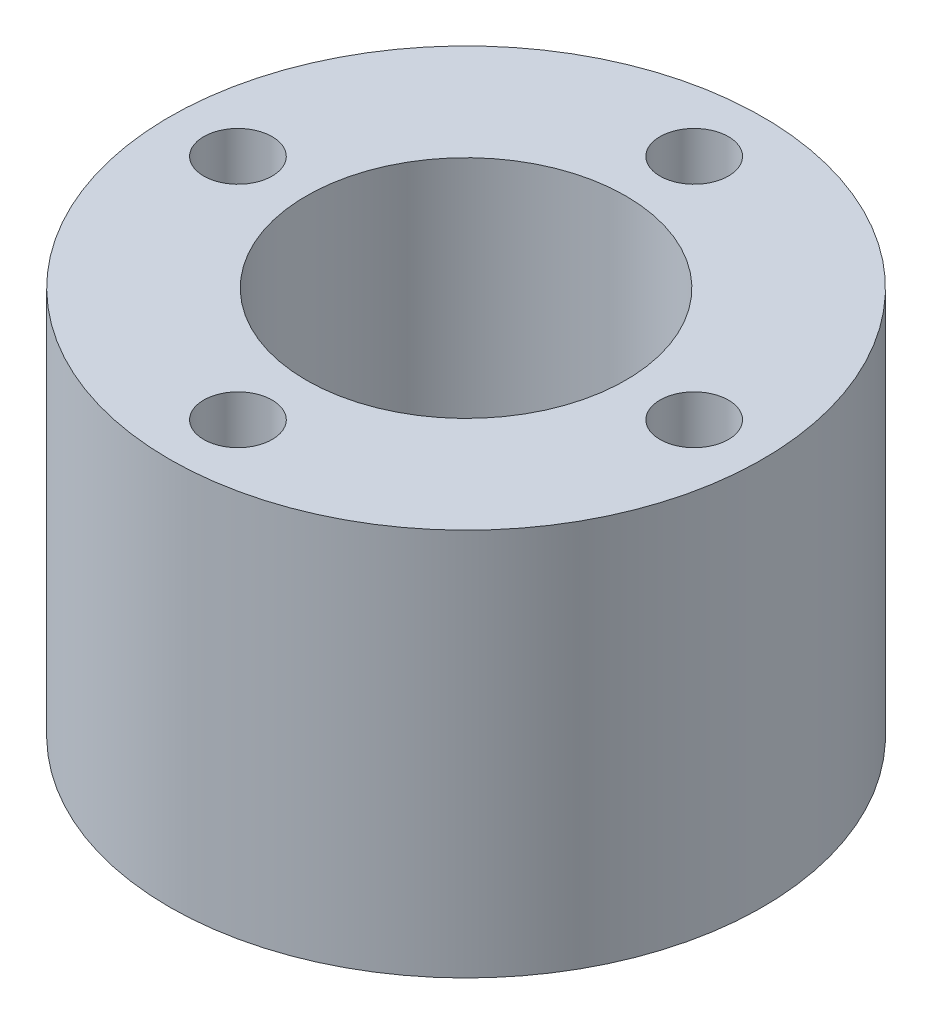
ISO-10303-21;
HEADER;
FILE_DESCRIPTION(('STEP AP214'),'2;1');
FILE_NAME('part.step','',(''),(''),'','','');
FILE_SCHEMA(('AUTOMOTIVE_DESIGN { 1 0 10303 214 1 1 1 1 }'));
ENDSEC;
DATA;
#1=APPLICATION_CONTEXT('core data for automotive mechanical design processes');
#2=APPLICATION_PROTOCOL_DEFINITION('international standard','automotive_design',2000,#1);
#3=PRODUCT_CONTEXT('',#1,'mechanical');
#4=PRODUCT('Part','Part','',(#3));
#5=PRODUCT_RELATED_PRODUCT_CATEGORY('part','',(#4));
#6=PRODUCT_DEFINITION_FORMATION('','',#4);
#7=PRODUCT_DEFINITION_CONTEXT('part definition',#1,'design');
#8=PRODUCT_DEFINITION('design','',#6,#7);
#9=PRODUCT_DEFINITION_SHAPE('','',#8);
#10=(LENGTH_UNIT() NAMED_UNIT(*) SI_UNIT(.MILLI.,.METRE.));
#11=(NAMED_UNIT(*) PLANE_ANGLE_UNIT() SI_UNIT($,.RADIAN.));
#12=(NAMED_UNIT(*) SI_UNIT($,.STERADIAN.) SOLID_ANGLE_UNIT());
#13=UNCERTAINTY_MEASURE_WITH_UNIT(LENGTH_MEASURE(1.E-05),#10,'distance_accuracy_value','');
#14=(GEOMETRIC_REPRESENTATION_CONTEXT(3) GLOBAL_UNCERTAINTY_ASSIGNED_CONTEXT((#13)) GLOBAL_UNIT_ASSIGNED_CONTEXT((#10,
#11,#12)) REPRESENTATION_CONTEXT('',''));
#15=CARTESIAN_POINT('',(0.,0.,0.));
#16=DIRECTION('',(0.,0.,1.));
#17=DIRECTION('',(1.,0.,0.));
#18=AXIS2_PLACEMENT_3D('',#15,#16,#17);
#19=CARTESIAN_POINT('',(0.,17.,0.));
#20=DIRECTION('',(0.,1.,0.));
#21=DIRECTION('',(0.,0.,1.));
#22=AXIS2_PLACEMENT_3D('',#19,#20,#21);
#23=PLANE('',#22);
#24=CARTESIAN_POINT('',(10.,17.,0.));
#25=DIRECTION('',(0.,1.,0.));
#26=DIRECTION('',(0.,0.,1.));
#27=AXIS2_PLACEMENT_3D('',#24,#25,#26);
#28=CIRCLE('',#27,1.5);
#29=CARTESIAN_POINT('',(10.,17.,1.5));
#30=VERTEX_POINT('',#29);
#31=EDGE_CURVE('E61',#30,#30,#28,.T.);
#32=ORIENTED_EDGE('',*,*,#31,.F.);
#33=EDGE_LOOP('',(#32));
#34=FACE_BOUND('',#33,.T.);
#35=CARTESIAN_POINT('',(0.,17.,-10.));
#36=DIRECTION('',(0.,1.,0.));
#37=DIRECTION('',(0.,0.,1.));
#38=AXIS2_PLACEMENT_3D('',#35,#36,#37);
#39=CIRCLE('',#38,1.5);
#40=CARTESIAN_POINT('',(0.,17.,-8.5));
#41=VERTEX_POINT('',#40);
#42=EDGE_CURVE('E52',#41,#41,#39,.T.);
#43=ORIENTED_EDGE('',*,*,#42,.F.);
#44=EDGE_LOOP('',(#43));
#45=FACE_BOUND('',#44,.T.);
#46=CARTESIAN_POINT('',(0.,17.,0.));
#47=DIRECTION('',(0.,1.,0.));
#48=DIRECTION('',(0.,0.,1.));
#49=AXIS2_PLACEMENT_3D('',#46,#47,#48);
#50=CIRCLE('',#49,13.);
#51=CARTESIAN_POINT('',(0.,17.,13.));
#52=VERTEX_POINT('',#51);
#53=EDGE_CURVE('E10',#52,#52,#50,.T.);
#54=ORIENTED_EDGE('',*,*,#53,.T.);
#55=EDGE_LOOP('',(#54));
#56=FACE_BOUND('',#55,.T.);
#57=CARTESIAN_POINT('',(0.,17.,0.));
#58=DIRECTION('',(0.,1.,0.));
#59=DIRECTION('',(0.,0.,1.));
#60=AXIS2_PLACEMENT_3D('',#57,#58,#59);
#61=CIRCLE('',#60,7.);
#62=CARTESIAN_POINT('',(0.,17.,7.));
#63=VERTEX_POINT('',#62);
#64=EDGE_CURVE('E48',#63,#63,#61,.T.);
#65=ORIENTED_EDGE('',*,*,#64,.F.);
#66=EDGE_LOOP('',(#65));
#67=FACE_BOUND('',#66,.T.);
#68=CARTESIAN_POINT('',(-10.,17.,0.));
#69=DIRECTION('',(0.,1.,0.));
#70=DIRECTION('',(0.,0.,1.));
#71=AXIS2_PLACEMENT_3D('',#68,#69,#70);
#72=CIRCLE('',#71,1.5);
#73=CARTESIAN_POINT('',(-10.,17.,1.5));
#74=VERTEX_POINT('',#73);
#75=EDGE_CURVE('E56',#74,#74,#72,.T.);
#76=ORIENTED_EDGE('',*,*,#75,.F.);
#77=EDGE_LOOP('',(#76));
#78=FACE_BOUND('',#77,.T.);
#79=CARTESIAN_POINT('',(0.,17.,10.));
#80=DIRECTION('',(0.,1.,0.));
#81=DIRECTION('',(0.,0.,1.));
#82=AXIS2_PLACEMENT_3D('',#79,#80,#81);
#83=CIRCLE('',#82,1.5);
#84=CARTESIAN_POINT('',(0.,17.,11.5));
#85=VERTEX_POINT('',#84);
#86=EDGE_CURVE('E72',#85,#85,#83,.T.);
#87=ORIENTED_EDGE('',*,*,#86,.F.);
#88=EDGE_LOOP('',(#87));
#89=FACE_BOUND('',#88,.T.);
#90=ADVANCED_FACE('F40',(#34,#45,#56,#67,#78,#89),#23,.T.);
#91=CARTESIAN_POINT('',(0.,0.,0.));
#92=DIRECTION('',(0.,1.,0.));
#93=DIRECTION('',(0.,0.,1.));
#94=AXIS2_PLACEMENT_3D('',#91,#92,#93);
#95=PLANE('',#94);
#96=CARTESIAN_POINT('',(0.,0.,0.));
#97=DIRECTION('',(0.,1.,0.));
#98=DIRECTION('',(0.,0.,1.));
#99=AXIS2_PLACEMENT_3D('',#96,#97,#98);
#100=CIRCLE('',#99,13.);
#101=CARTESIAN_POINT('',(0.,0.,13.));
#102=VERTEX_POINT('',#101);
#103=EDGE_CURVE('E41',#102,#102,#100,.T.);
#104=ORIENTED_EDGE('',*,*,#103,.F.);
#105=EDGE_LOOP('',(#104));
#106=FACE_BOUND('',#105,.T.);
#107=CARTESIAN_POINT('',(0.,0.,0.));
#108=DIRECTION('',(0.,1.,0.));
#109=DIRECTION('',(0.,0.,1.));
#110=AXIS2_PLACEMENT_3D('',#107,#108,#109);
#111=CIRCLE('',#110,7.);
#112=CARTESIAN_POINT('',(0.,0.,7.));
#113=VERTEX_POINT('',#112);
#114=EDGE_CURVE('E49',#113,#113,#111,.T.);
#115=ORIENTED_EDGE('',*,*,#114,.T.);
#116=EDGE_LOOP('',(#115));
#117=FACE_BOUND('',#116,.T.);
#118=CARTESIAN_POINT('',(0.,0.,-10.));
#119=DIRECTION('',(0.,1.,0.));
#120=DIRECTION('',(0.,0.,1.));
#121=AXIS2_PLACEMENT_3D('',#118,#119,#120);
#122=CIRCLE('',#121,1.5);
#123=CARTESIAN_POINT('',(0.,0.,-8.5));
#124=VERTEX_POINT('',#123);
#125=EDGE_CURVE('E57',#124,#124,#122,.T.);
#126=ORIENTED_EDGE('',*,*,#125,.T.);
#127=EDGE_LOOP('',(#126));
#128=FACE_BOUND('',#127,.T.);
#129=CARTESIAN_POINT('',(-10.,0.,0.));
#130=DIRECTION('',(0.,1.,0.));
#131=DIRECTION('',(0.,0.,1.));
#132=AXIS2_PLACEMENT_3D('',#129,#130,#131);
#133=CIRCLE('',#132,1.5);
#134=CARTESIAN_POINT('',(-10.,0.,1.5));
#135=VERTEX_POINT('',#134);
#136=EDGE_CURVE('E65',#135,#135,#133,.T.);
#137=ORIENTED_EDGE('',*,*,#136,.T.);
#138=EDGE_LOOP('',(#137));
#139=FACE_BOUND('',#138,.T.);
#140=CARTESIAN_POINT('',(10.,0.,0.));
#141=DIRECTION('',(0.,1.,0.));
#142=DIRECTION('',(0.,0.,1.));
#143=AXIS2_PLACEMENT_3D('',#140,#141,#142);
#144=CIRCLE('',#143,1.5);
#145=CARTESIAN_POINT('',(10.,0.,1.5));
#146=VERTEX_POINT('',#145);
#147=EDGE_CURVE('E66',#146,#146,#144,.T.);
#148=ORIENTED_EDGE('',*,*,#147,.T.);
#149=EDGE_LOOP('',(#148));
#150=FACE_BOUND('',#149,.T.);
#151=CARTESIAN_POINT('',(0.,0.,10.));
#152=DIRECTION('',(0.,1.,0.));
#153=DIRECTION('',(0.,0.,1.));
#154=AXIS2_PLACEMENT_3D('',#151,#152,#153);
#155=CIRCLE('',#154,1.5);
#156=CARTESIAN_POINT('',(0.,0.,11.5));
#157=VERTEX_POINT('',#156);
#158=EDGE_CURVE('E74',#157,#157,#155,.T.);
#159=ORIENTED_EDGE('',*,*,#158,.T.);
#160=EDGE_LOOP('',(#159));
#161=FACE_BOUND('',#160,.T.);
#162=ADVANCED_FACE('F84',(#106,#117,#128,#139,#150,#161),#95,.F.);
#163=CARTESIAN_POINT('',(0.,17.,0.));
#164=DIRECTION('',(0.,-1.,0.));
#165=DIRECTION('',(0.,0.,-1.));
#166=AXIS2_PLACEMENT_3D('',#163,#164,#165);
#167=CYLINDRICAL_SURFACE('',#166,13.);
#168=ORIENTED_EDGE('',*,*,#53,.F.);
#169=EDGE_LOOP('',(#168));
#170=FACE_BOUND('',#169,.T.);
#171=ORIENTED_EDGE('',*,*,#103,.T.);
#172=EDGE_LOOP('',(#171));
#173=FACE_BOUND('',#172,.T.);
#174=ADVANCED_FACE('F39',(#170,#173),#167,.T.);
#175=CARTESIAN_POINT('',(0.,17.,0.));
#176=DIRECTION('',(0.,-1.,0.));
#177=DIRECTION('',(0.,0.,-1.));
#178=AXIS2_PLACEMENT_3D('',#175,#176,#177);
#179=CYLINDRICAL_SURFACE('',#178,7.);
#180=ORIENTED_EDGE('',*,*,#64,.T.);
#181=EDGE_LOOP('',(#180));
#182=FACE_BOUND('',#181,.T.);
#183=ORIENTED_EDGE('',*,*,#114,.F.);
#184=EDGE_LOOP('',(#183));
#185=FACE_BOUND('',#184,.T.);
#186=ADVANCED_FACE('F92',(#182,#185),#179,.F.);
#187=CARTESIAN_POINT('',(0.,17.,-10.));
#188=DIRECTION('',(0.,-1.,0.));
#189=DIRECTION('',(0.,0.,-1.));
#190=AXIS2_PLACEMENT_3D('',#187,#188,#189);
#191=CYLINDRICAL_SURFACE('',#190,1.5);
#192=ORIENTED_EDGE('',*,*,#42,.T.);
#193=EDGE_LOOP('',(#192));
#194=FACE_BOUND('',#193,.T.);
#195=ORIENTED_EDGE('',*,*,#125,.F.);
#196=EDGE_LOOP('',(#195));
#197=FACE_BOUND('',#196,.T.);
#198=ADVANCED_FACE('F100',(#194,#197),#191,.F.);
#199=CARTESIAN_POINT('',(-10.,17.,0.));
#200=DIRECTION('',(0.,-1.,0.));
#201=DIRECTION('',(0.,0.,-1.));
#202=AXIS2_PLACEMENT_3D('',#199,#200,#201);
#203=CYLINDRICAL_SURFACE('',#202,1.5);
#204=ORIENTED_EDGE('',*,*,#75,.T.);
#205=EDGE_LOOP('',(#204));
#206=FACE_BOUND('',#205,.T.);
#207=ORIENTED_EDGE('',*,*,#136,.F.);
#208=EDGE_LOOP('',(#207));
#209=FACE_BOUND('',#208,.T.);
#210=ADVANCED_FACE('F102',(#206,#209),#203,.F.);
#211=CARTESIAN_POINT('',(10.,17.,0.));
#212=DIRECTION('',(0.,-1.,0.));
#213=DIRECTION('',(0.,0.,-1.));
#214=AXIS2_PLACEMENT_3D('',#211,#212,#213);
#215=CYLINDRICAL_SURFACE('',#214,1.5);
#216=ORIENTED_EDGE('',*,*,#31,.T.);
#217=EDGE_LOOP('',(#216));
#218=FACE_BOUND('',#217,.T.);
#219=ORIENTED_EDGE('',*,*,#147,.F.);
#220=EDGE_LOOP('',(#219));
#221=FACE_BOUND('',#220,.T.);
#222=ADVANCED_FACE('F103',(#218,#221),#215,.F.);
#223=CARTESIAN_POINT('',(0.,17.,10.));
#224=DIRECTION('',(0.,-1.,0.));
#225=DIRECTION('',(0.,0.,-1.));
#226=AXIS2_PLACEMENT_3D('',#223,#224,#225);
#227=CYLINDRICAL_SURFACE('',#226,1.5);
#228=ORIENTED_EDGE('',*,*,#86,.T.);
#229=EDGE_LOOP('',(#228));
#230=FACE_BOUND('',#229,.T.);
#231=ORIENTED_EDGE('',*,*,#158,.F.);
#232=EDGE_LOOP('',(#231));
#233=FACE_BOUND('',#232,.T.);
#234=ADVANCED_FACE('F79',(#230,#233),#227,.F.);
#235=CLOSED_SHELL('',(#90,#162,#174,#186,#198,#210,#222,#234));
#236=MANIFOLD_SOLID_BREP('B2',#235);
#237=ADVANCED_BREP_SHAPE_REPRESENTATION('',(#18,#236),#14);
#238=SHAPE_DEFINITION_REPRESENTATION(#9,#237);
ENDSEC;
END-ISO-10303-21;
